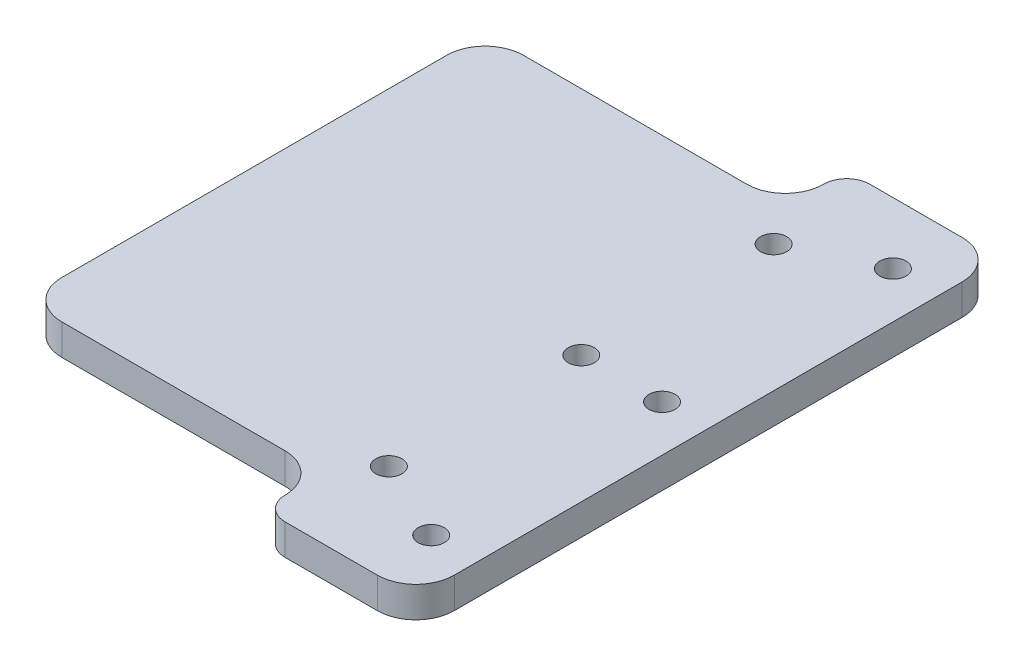
ISO-10303-21;
HEADER;
FILE_DESCRIPTION(('STEP AP214'),'2;1');
FILE_NAME('part.step','',(''),(''),'','','');
FILE_SCHEMA(('AUTOMOTIVE_DESIGN { 1 0 10303 214 1 1 1 1 }'));
ENDSEC;
DATA;
#1=APPLICATION_CONTEXT('core data for automotive mechanical design processes');
#2=APPLICATION_PROTOCOL_DEFINITION('international standard','automotive_design',2000,#1);
#3=PRODUCT_CONTEXT('',#1,'mechanical');
#4=PRODUCT('Part','Part','',(#3));
#5=PRODUCT_RELATED_PRODUCT_CATEGORY('part','',(#4));
#6=PRODUCT_DEFINITION_FORMATION('','',#4);
#7=PRODUCT_DEFINITION_CONTEXT('part definition',#1,'design');
#8=PRODUCT_DEFINITION('design','',#6,#7);
#9=PRODUCT_DEFINITION_SHAPE('','',#8);
#10=(LENGTH_UNIT() NAMED_UNIT(*) SI_UNIT(.MILLI.,.METRE.));
#11=(NAMED_UNIT(*) PLANE_ANGLE_UNIT() SI_UNIT($,.RADIAN.));
#12=(NAMED_UNIT(*) SI_UNIT($,.STERADIAN.) SOLID_ANGLE_UNIT());
#13=UNCERTAINTY_MEASURE_WITH_UNIT(LENGTH_MEASURE(1.E-05),#10,'distance_accuracy_value','');
#14=(GEOMETRIC_REPRESENTATION_CONTEXT(3) GLOBAL_UNCERTAINTY_ASSIGNED_CONTEXT((#13)) GLOBAL_UNIT_ASSIGNED_CONTEXT((#10,
#11,#12)) REPRESENTATION_CONTEXT('',''));
#15=CARTESIAN_POINT('',(0.,0.,0.));
#16=DIRECTION('',(0.,0.,1.));
#17=DIRECTION('',(1.,0.,0.));
#18=AXIS2_PLACEMENT_3D('',#15,#16,#17);
#19=CARTESIAN_POINT('',(0.,4.,0.));
#20=DIRECTION('',(0.,-1.,0.));
#21=DIRECTION('',(0.,0.,-1.));
#22=AXIS2_PLACEMENT_3D('',#19,#20,#21);
#23=PLANE('',#22);
#24=CARTESIAN_POINT('',(34.,4.,35.));
#25=DIRECTION('',(0.,-1.,0.));
#26=DIRECTION('',(0.,0.,-1.));
#27=AXIS2_PLACEMENT_3D('',#24,#25,#26);
#28=CIRCLE('',#27,5.);
#29=CARTESIAN_POINT('',(34.,4.,30.));
#30=VERTEX_POINT('',#29);
#31=CARTESIAN_POINT('',(39.,4.,35.));
#32=VERTEX_POINT('',#31);
#33=EDGE_CURVE('E222',#30,#32,#28,.T.);
#34=ORIENTED_EDGE('',*,*,#33,.T.);
#35=CARTESIAN_POINT('',(42.,4.,35.));
#36=DIRECTION('',(0.,-1.,0.));
#37=DIRECTION('',(0.,0.,-1.));
#38=AXIS2_PLACEMENT_3D('',#35,#36,#37);
#39=CIRCLE('',#38,3.);
#40=CARTESIAN_POINT('',(42.,4.,38.));
#41=VERTEX_POINT('',#40);
#42=EDGE_CURVE('E47',#32,#41,#39,.F.);
#43=ORIENTED_EDGE('',*,*,#42,.T.);
#44=DIRECTION('',(1.,0.,0.));
#45=VECTOR('',#44,1.);
#46=CARTESIAN_POINT('',(59.,4.,38.));
#47=LINE('',#46,#45);
#48=CARTESIAN_POINT('',(54.,4.,38.));
#49=VERTEX_POINT('',#48);
#50=EDGE_CURVE('E177',#41,#49,#47,.T.);
#51=ORIENTED_EDGE('',*,*,#50,.T.);
#52=CARTESIAN_POINT('',(54.,4.,33.));
#53=DIRECTION('',(0.,-1.,0.));
#54=DIRECTION('',(0.,0.,-1.));
#55=AXIS2_PLACEMENT_3D('',#52,#53,#54);
#56=CIRCLE('',#55,5.);
#57=CARTESIAN_POINT('',(59.,4.,33.));
#58=VERTEX_POINT('',#57);
#59=EDGE_CURVE('E189',#49,#58,#56,.F.);
#60=ORIENTED_EDGE('',*,*,#59,.T.);
#61=DIRECTION('',(0.,0.,-1.));
#62=VECTOR('',#61,1.);
#63=CARTESIAN_POINT('',(59.,4.,-38.));
#64=LINE('',#63,#62);
#65=CARTESIAN_POINT('',(59.,4.,-33.));
#66=VERTEX_POINT('',#65);
#67=EDGE_CURVE('E171',#58,#66,#64,.T.);
#68=ORIENTED_EDGE('',*,*,#67,.T.);
#69=CARTESIAN_POINT('',(54.,4.,-33.));
#70=DIRECTION('',(0.,-1.,0.));
#71=DIRECTION('',(0.,0.,-1.));
#72=AXIS2_PLACEMENT_3D('',#69,#70,#71);
#73=CIRCLE('',#72,5.);
#74=CARTESIAN_POINT('',(54.,4.,-38.));
#75=VERTEX_POINT('',#74);
#76=EDGE_CURVE('E187',#66,#75,#73,.F.);
#77=ORIENTED_EDGE('',*,*,#76,.T.);
#78=DIRECTION('',(-1.,0.,0.));
#79=VECTOR('',#78,1.);
#80=CARTESIAN_POINT('',(39.,4.,-38.));
#81=LINE('',#80,#79);
#82=CARTESIAN_POINT('',(42.,4.,-38.));
#83=VERTEX_POINT('',#82);
#84=EDGE_CURVE('E323',#75,#83,#81,.T.);
#85=ORIENTED_EDGE('',*,*,#84,.T.);
#86=CARTESIAN_POINT('',(42.,4.,-35.));
#87=DIRECTION('',(0.,-1.,0.));
#88=DIRECTION('',(0.,0.,-1.));
#89=AXIS2_PLACEMENT_3D('',#86,#87,#88);
#90=CIRCLE('',#89,3.);
#91=CARTESIAN_POINT('',(39.,4.,-35.));
#92=VERTEX_POINT('',#91);
#93=EDGE_CURVE('E230',#83,#92,#90,.F.);
#94=ORIENTED_EDGE('',*,*,#93,.T.);
#95=CARTESIAN_POINT('',(34.,4.,-35.));
#96=DIRECTION('',(0.,-1.,0.));
#97=DIRECTION('',(0.,0.,-1.));
#98=AXIS2_PLACEMENT_3D('',#95,#96,#97);
#99=CIRCLE('',#98,5.);
#100=CARTESIAN_POINT('',(34.,4.,-30.));
#101=VERTEX_POINT('',#100);
#102=EDGE_CURVE('E219',#92,#101,#99,.T.);
#103=ORIENTED_EDGE('',*,*,#102,.T.);
#104=DIRECTION('',(-1.,0.,0.));
#105=VECTOR('',#104,1.);
#106=CARTESIAN_POINT('',(0.,4.,-30.));
#107=LINE('',#106,#105);
#108=CARTESIAN_POINT('',(5.,4.,-30.));
#109=VERTEX_POINT('',#108);
#110=EDGE_CURVE('E250',#101,#109,#107,.T.);
#111=ORIENTED_EDGE('',*,*,#110,.T.);
#112=CARTESIAN_POINT('',(5.,4.,-25.));
#113=DIRECTION('',(0.,-1.,0.));
#114=DIRECTION('',(0.,0.,-1.));
#115=AXIS2_PLACEMENT_3D('',#112,#113,#114);
#116=CIRCLE('',#115,5.);
#117=CARTESIAN_POINT('',(0.,4.,-25.));
#118=VERTEX_POINT('',#117);
#119=EDGE_CURVE('E191',#109,#118,#116,.F.);
#120=ORIENTED_EDGE('',*,*,#119,.T.);
#121=DIRECTION('',(0.,0.,1.));
#122=VECTOR('',#121,1.);
#123=CARTESIAN_POINT('',(0.,4.,0.));
#124=LINE('',#123,#122);
#125=CARTESIAN_POINT('',(0.,4.,25.));
#126=VERTEX_POINT('',#125);
#127=EDGE_CURVE('E248',#118,#126,#124,.T.);
#128=ORIENTED_EDGE('',*,*,#127,.T.);
#129=CARTESIAN_POINT('',(5.,4.,25.));
#130=DIRECTION('',(0.,-1.,0.));
#131=DIRECTION('',(0.,0.,-1.));
#132=AXIS2_PLACEMENT_3D('',#129,#130,#131);
#133=CIRCLE('',#132,5.);
#134=CARTESIAN_POINT('',(5.,4.,30.));
#135=VERTEX_POINT('',#134);
#136=EDGE_CURVE('E193',#126,#135,#133,.F.);
#137=ORIENTED_EDGE('',*,*,#136,.T.);
#138=DIRECTION('',(1.,0.,0.));
#139=VECTOR('',#138,1.);
#140=CARTESIAN_POINT('',(39.,4.,30.));
#141=LINE('',#140,#139);
#142=EDGE_CURVE('E159',#135,#30,#141,.T.);
#143=ORIENTED_EDGE('',*,*,#142,.T.);
#144=EDGE_LOOP('',(#34,#43,#51,#60,#68,#77,#85,#94,#103,#111,#120,#128,#137,#143));
#145=FACE_BOUND('',#144,.T.);
#146=CARTESIAN_POINT('',(42.5,4.,25.));
#147=DIRECTION('',(0.,1.,0.));
#148=DIRECTION('',(0.,0.,1.));
#149=AXIS2_PLACEMENT_3D('',#146,#147,#148);
#150=CIRCLE('',#149,1.69999999999999);
#151=CARTESIAN_POINT('',(42.5,4.,26.7));
#152=VERTEX_POINT('',#151);
#153=EDGE_CURVE('E258',#152,#152,#150,.T.);
#154=ORIENTED_EDGE('',*,*,#153,.F.);
#155=EDGE_LOOP('',(#154));
#156=FACE_BOUND('',#155,.T.);
#157=CARTESIAN_POINT('',(42.5,4.,-25.));
#158=DIRECTION('',(0.,1.,0.));
#159=DIRECTION('',(0.,0.,1.));
#160=AXIS2_PLACEMENT_3D('',#157,#158,#159);
#161=CIRCLE('',#160,1.69999999999999);
#162=CARTESIAN_POINT('',(42.5,4.,-23.3));
#163=VERTEX_POINT('',#162);
#164=EDGE_CURVE('E313',#163,#163,#161,.T.);
#165=ORIENTED_EDGE('',*,*,#164,.F.);
#166=EDGE_LOOP('',(#165));
#167=FACE_BOUND('',#166,.T.);
#168=CARTESIAN_POINT('',(42.5,4.,0.));
#169=DIRECTION('',(0.,1.,0.));
#170=DIRECTION('',(0.,0.,1.));
#171=AXIS2_PLACEMENT_3D('',#168,#169,#170);
#172=CIRCLE('',#171,1.7);
#173=CARTESIAN_POINT('',(42.5,4.,1.7));
#174=VERTEX_POINT('',#173);
#175=EDGE_CURVE('E506',#174,#174,#172,.T.);
#176=ORIENTED_EDGE('',*,*,#175,.F.);
#177=EDGE_LOOP('',(#176));
#178=FACE_BOUND('',#177,.T.);
#179=CARTESIAN_POINT('',(53.,4.,-30.));
#180=DIRECTION('',(0.,1.,0.));
#181=DIRECTION('',(0.,0.,1.));
#182=AXIS2_PLACEMENT_3D('',#179,#180,#181);
#183=CIRCLE('',#182,1.7);
#184=CARTESIAN_POINT('',(53.,4.,-28.3));
#185=VERTEX_POINT('',#184);
#186=EDGE_CURVE('E511',#185,#185,#183,.T.);
#187=ORIENTED_EDGE('',*,*,#186,.F.);
#188=EDGE_LOOP('',(#187));
#189=FACE_BOUND('',#188,.T.);
#190=CARTESIAN_POINT('',(53.,4.,0.));
#191=DIRECTION('',(0.,1.,0.));
#192=DIRECTION('',(0.,0.,1.));
#193=AXIS2_PLACEMENT_3D('',#190,#191,#192);
#194=CIRCLE('',#193,1.7);
#195=CARTESIAN_POINT('',(53.,4.,1.7));
#196=VERTEX_POINT('',#195);
#197=EDGE_CURVE('E535',#196,#196,#194,.T.);
#198=ORIENTED_EDGE('',*,*,#197,.F.);
#199=EDGE_LOOP('',(#198));
#200=FACE_BOUND('',#199,.T.);
#201=CARTESIAN_POINT('',(53.,4.,30.));
#202=DIRECTION('',(0.,1.,0.));
#203=DIRECTION('',(0.,0.,1.));
#204=AXIS2_PLACEMENT_3D('',#201,#202,#203);
#205=CIRCLE('',#204,1.7);
#206=CARTESIAN_POINT('',(53.,4.,31.7));
#207=VERTEX_POINT('',#206);
#208=EDGE_CURVE('E529',#207,#207,#205,.T.);
#209=ORIENTED_EDGE('',*,*,#208,.F.);
#210=EDGE_LOOP('',(#209));
#211=FACE_BOUND('',#210,.T.);
#212=ADVANCED_FACE('F39',(#145,#156,#167,#178,#189,#200,#211),#23,.F.);
#213=CARTESIAN_POINT('',(0.,0.,0.));
#214=DIRECTION('',(0.,-1.,0.));
#215=DIRECTION('',(0.,0.,-1.));
#216=AXIS2_PLACEMENT_3D('',#213,#214,#215);
#217=PLANE('',#216);
#218=CARTESIAN_POINT('',(53.,0.,0.));
#219=DIRECTION('',(0.,1.,0.));
#220=DIRECTION('',(0.,0.,1.));
#221=AXIS2_PLACEMENT_3D('',#218,#219,#220);
#222=CIRCLE('',#221,1.7);
#223=CARTESIAN_POINT('',(53.,0.,1.7));
#224=VERTEX_POINT('',#223);
#225=EDGE_CURVE('E532',#224,#224,#222,.T.);
#226=ORIENTED_EDGE('',*,*,#225,.T.);
#227=EDGE_LOOP('',(#226));
#228=FACE_BOUND('',#227,.T.);
#229=CARTESIAN_POINT('',(42.5,0.,0.));
#230=DIRECTION('',(0.,1.,0.));
#231=DIRECTION('',(0.,0.,1.));
#232=AXIS2_PLACEMENT_3D('',#229,#230,#231);
#233=CIRCLE('',#232,1.7);
#234=CARTESIAN_POINT('',(42.5,0.,1.7));
#235=VERTEX_POINT('',#234);
#236=EDGE_CURVE('E509',#235,#235,#233,.T.);
#237=ORIENTED_EDGE('',*,*,#236,.T.);
#238=EDGE_LOOP('',(#237));
#239=FACE_BOUND('',#238,.T.);
#240=CARTESIAN_POINT('',(42.5,0.,25.));
#241=DIRECTION('',(0.,1.,0.));
#242=DIRECTION('',(0.,0.,1.));
#243=AXIS2_PLACEMENT_3D('',#240,#241,#242);
#244=CIRCLE('',#243,1.69999999999999);
#245=CARTESIAN_POINT('',(42.5,0.,26.7));
#246=VERTEX_POINT('',#245);
#247=EDGE_CURVE('E311',#246,#246,#244,.T.);
#248=ORIENTED_EDGE('',*,*,#247,.T.);
#249=EDGE_LOOP('',(#248));
#250=FACE_BOUND('',#249,.T.);
#251=DIRECTION('',(1.,0.,0.));
#252=VECTOR('',#251,1.);
#253=CARTESIAN_POINT('',(59.,0.,38.));
#254=LINE('',#253,#252);
#255=CARTESIAN_POINT('',(42.,0.,38.));
#256=VERTEX_POINT('',#255);
#257=CARTESIAN_POINT('',(54.,0.,38.));
#258=VERTEX_POINT('',#257);
#259=EDGE_CURVE('E168',#256,#258,#254,.T.);
#260=ORIENTED_EDGE('',*,*,#259,.F.);
#261=CARTESIAN_POINT('',(42.,0.,35.));
#262=DIRECTION('',(0.,-1.,0.));
#263=DIRECTION('',(0.,0.,-1.));
#264=AXIS2_PLACEMENT_3D('',#261,#262,#263);
#265=CIRCLE('',#264,3.);
#266=CARTESIAN_POINT('',(39.,0.,35.));
#267=VERTEX_POINT('',#266);
#268=EDGE_CURVE('E228',#256,#267,#265,.T.);
#269=ORIENTED_EDGE('',*,*,#268,.T.);
#270=CARTESIAN_POINT('',(34.,0.,35.));
#271=DIRECTION('',(0.,-1.,0.));
#272=DIRECTION('',(0.,0.,-1.));
#273=AXIS2_PLACEMENT_3D('',#270,#271,#272);
#274=CIRCLE('',#273,5.);
#275=CARTESIAN_POINT('',(34.,0.,30.));
#276=VERTEX_POINT('',#275);
#277=EDGE_CURVE('E167',#267,#276,#274,.F.);
#278=ORIENTED_EDGE('',*,*,#277,.T.);
#279=DIRECTION('',(1.,0.,0.));
#280=VECTOR('',#279,1.);
#281=CARTESIAN_POINT('',(39.,0.,30.));
#282=LINE('',#281,#280);
#283=CARTESIAN_POINT('',(5.,0.,30.));
#284=VERTEX_POINT('',#283);
#285=EDGE_CURVE('E156',#284,#276,#282,.T.);
#286=ORIENTED_EDGE('',*,*,#285,.F.);
#287=CARTESIAN_POINT('',(5.,0.,25.));
#288=DIRECTION('',(0.,-1.,0.));
#289=DIRECTION('',(0.,0.,-1.));
#290=AXIS2_PLACEMENT_3D('',#287,#288,#289);
#291=CIRCLE('',#290,5.);
#292=CARTESIAN_POINT('',(0.,0.,25.));
#293=VERTEX_POINT('',#292);
#294=EDGE_CURVE('E140',#284,#293,#291,.T.);
#295=ORIENTED_EDGE('',*,*,#294,.T.);
#296=DIRECTION('',(0.,0.,1.));
#297=VECTOR('',#296,1.);
#298=CARTESIAN_POINT('',(0.,0.,30.));
#299=LINE('',#298,#297);
#300=CARTESIAN_POINT('',(0.,0.,-25.));
#301=VERTEX_POINT('',#300);
#302=EDGE_CURVE('E169',#301,#293,#299,.T.);
#303=ORIENTED_EDGE('',*,*,#302,.F.);
#304=CARTESIAN_POINT('',(5.,0.,-25.));
#305=DIRECTION('',(0.,-1.,0.));
#306=DIRECTION('',(0.,0.,-1.));
#307=AXIS2_PLACEMENT_3D('',#304,#305,#306);
#308=CIRCLE('',#307,5.);
#309=CARTESIAN_POINT('',(5.,0.,-30.));
#310=VERTEX_POINT('',#309);
#311=EDGE_CURVE('E150',#301,#310,#308,.T.);
#312=ORIENTED_EDGE('',*,*,#311,.T.);
#313=DIRECTION('',(-1.,0.,0.));
#314=VECTOR('',#313,1.);
#315=CARTESIAN_POINT('',(0.,0.,-30.));
#316=LINE('',#315,#314);
#317=CARTESIAN_POINT('',(34.,0.,-30.));
#318=VERTEX_POINT('',#317);
#319=EDGE_CURVE('E173',#318,#310,#316,.T.);
#320=ORIENTED_EDGE('',*,*,#319,.F.);
#321=CARTESIAN_POINT('',(34.,0.,-35.));
#322=DIRECTION('',(0.,-1.,0.));
#323=DIRECTION('',(0.,0.,-1.));
#324=AXIS2_PLACEMENT_3D('',#321,#322,#323);
#325=CIRCLE('',#324,5.);
#326=CARTESIAN_POINT('',(39.,0.,-35.));
#327=VERTEX_POINT('',#326);
#328=EDGE_CURVE('E217',#318,#327,#325,.F.);
#329=ORIENTED_EDGE('',*,*,#328,.T.);
#330=CARTESIAN_POINT('',(42.,0.,-35.));
#331=DIRECTION('',(0.,-1.,0.));
#332=DIRECTION('',(0.,0.,-1.));
#333=AXIS2_PLACEMENT_3D('',#330,#331,#332);
#334=CIRCLE('',#333,3.);
#335=CARTESIAN_POINT('',(42.,0.,-38.));
#336=VERTEX_POINT('',#335);
#337=EDGE_CURVE('E60',#327,#336,#334,.T.);
#338=ORIENTED_EDGE('',*,*,#337,.T.);
#339=DIRECTION('',(-1.,0.,0.));
#340=VECTOR('',#339,1.);
#341=CARTESIAN_POINT('',(39.,0.,-38.));
#342=LINE('',#341,#340);
#343=CARTESIAN_POINT('',(54.,0.,-38.));
#344=VERTEX_POINT('',#343);
#345=EDGE_CURVE('E257',#344,#336,#342,.T.);
#346=ORIENTED_EDGE('',*,*,#345,.F.);
#347=CARTESIAN_POINT('',(54.,0.,-33.));
#348=DIRECTION('',(0.,-1.,0.));
#349=DIRECTION('',(0.,0.,-1.));
#350=AXIS2_PLACEMENT_3D('',#347,#348,#349);
#351=CIRCLE('',#350,5.);
#352=CARTESIAN_POINT('',(59.,0.,-33.));
#353=VERTEX_POINT('',#352);
#354=EDGE_CURVE('E160',#344,#353,#351,.T.);
#355=ORIENTED_EDGE('',*,*,#354,.T.);
#356=DIRECTION('',(0.,0.,-1.));
#357=VECTOR('',#356,1.);
#358=CARTESIAN_POINT('',(59.,0.,-38.));
#359=LINE('',#358,#357);
#360=CARTESIAN_POINT('',(59.,0.,33.));
#361=VERTEX_POINT('',#360);
#362=EDGE_CURVE('E254',#361,#353,#359,.T.);
#363=ORIENTED_EDGE('',*,*,#362,.F.);
#364=CARTESIAN_POINT('',(54.,0.,33.));
#365=DIRECTION('',(0.,-1.,0.));
#366=DIRECTION('',(0.,0.,-1.));
#367=AXIS2_PLACEMENT_3D('',#364,#365,#366);
#368=CIRCLE('',#367,5.);
#369=EDGE_CURVE('E180',#361,#258,#368,.T.);
#370=ORIENTED_EDGE('',*,*,#369,.T.);
#371=EDGE_LOOP('',(#260,#269,#278,#286,#295,#303,#312,#320,#329,#338,#346,#355,#363,#370));
#372=FACE_BOUND('',#371,.T.);
#373=CARTESIAN_POINT('',(42.5,0.,-25.));
#374=DIRECTION('',(0.,1.,0.));
#375=DIRECTION('',(0.,0.,1.));
#376=AXIS2_PLACEMENT_3D('',#373,#374,#375);
#377=CIRCLE('',#376,1.69999999999999);
#378=CARTESIAN_POINT('',(42.5,0.,-23.3));
#379=VERTEX_POINT('',#378);
#380=EDGE_CURVE('E317',#379,#379,#377,.T.);
#381=ORIENTED_EDGE('',*,*,#380,.T.);
#382=EDGE_LOOP('',(#381));
#383=FACE_BOUND('',#382,.T.);
#384=CARTESIAN_POINT('',(53.,0.,-30.));
#385=DIRECTION('',(0.,1.,0.));
#386=DIRECTION('',(0.,0.,1.));
#387=AXIS2_PLACEMENT_3D('',#384,#385,#386);
#388=CIRCLE('',#387,1.7);
#389=CARTESIAN_POINT('',(53.,0.,-28.3));
#390=VERTEX_POINT('',#389);
#391=EDGE_CURVE('E515',#390,#390,#388,.T.);
#392=ORIENTED_EDGE('',*,*,#391,.T.);
#393=EDGE_LOOP('',(#392));
#394=FACE_BOUND('',#393,.T.);
#395=CARTESIAN_POINT('',(53.,0.,30.));
#396=DIRECTION('',(0.,1.,0.));
#397=DIRECTION('',(0.,0.,1.));
#398=AXIS2_PLACEMENT_3D('',#395,#396,#397);
#399=CIRCLE('',#398,1.7);
#400=CARTESIAN_POINT('',(53.,0.,31.7));
#401=VERTEX_POINT('',#400);
#402=EDGE_CURVE('E527',#401,#401,#399,.T.);
#403=ORIENTED_EDGE('',*,*,#402,.T.);
#404=EDGE_LOOP('',(#403));
#405=FACE_BOUND('',#404,.T.);
#406=ADVANCED_FACE('F164',(#228,#239,#250,#372,#383,#394,#405),#217,.T.);
#407=CARTESIAN_POINT('',(59.,4.,-38.));
#408=DIRECTION('',(-1.,0.,0.));
#409=DIRECTION('',(0.,0.,1.));
#410=AXIS2_PLACEMENT_3D('',#407,#408,#409);
#411=PLANE('',#410);
#412=ORIENTED_EDGE('',*,*,#67,.F.);
#413=DIRECTION('',(0.,-1.,0.));
#414=VECTOR('',#413,1.);
#415=CARTESIAN_POINT('',(59.,4.,33.));
#416=LINE('',#415,#414);
#417=EDGE_CURVE('E208',#58,#361,#416,.T.);
#418=ORIENTED_EDGE('',*,*,#417,.T.);
#419=ORIENTED_EDGE('',*,*,#362,.T.);
#420=DIRECTION('',(0.,-1.,0.));
#421=VECTOR('',#420,1.);
#422=CARTESIAN_POINT('',(59.,4.,-33.));
#423=LINE('',#422,#421);
#424=EDGE_CURVE('E206',#353,#66,#423,.F.);
#425=ORIENTED_EDGE('',*,*,#424,.T.);
#426=EDGE_LOOP('',(#412,#418,#419,#425));
#427=FACE_BOUND('',#426,.T.);
#428=ADVANCED_FACE('F288',(#427),#411,.F.);
#429=CARTESIAN_POINT('',(39.,4.,-38.));
#430=DIRECTION('',(0.,0.,1.));
#431=DIRECTION('',(1.,0.,0.));
#432=AXIS2_PLACEMENT_3D('',#429,#430,#431);
#433=PLANE('',#432);
#434=ORIENTED_EDGE('',*,*,#345,.T.);
#435=DIRECTION('',(0.,-1.,0.));
#436=VECTOR('',#435,1.);
#437=CARTESIAN_POINT('',(42.,4.,-38.));
#438=LINE('',#437,#436);
#439=EDGE_CURVE('E11',#336,#83,#438,.F.);
#440=ORIENTED_EDGE('',*,*,#439,.T.);
#441=ORIENTED_EDGE('',*,*,#84,.F.);
#442=DIRECTION('',(0.,-1.,0.));
#443=VECTOR('',#442,1.);
#444=CARTESIAN_POINT('',(54.,4.,-38.));
#445=LINE('',#444,#443);
#446=EDGE_CURVE('E214',#75,#344,#445,.T.);
#447=ORIENTED_EDGE('',*,*,#446,.T.);
#448=EDGE_LOOP('',(#434,#440,#441,#447));
#449=FACE_BOUND('',#448,.T.);
#450=ADVANCED_FACE('F281',(#449),#433,.F.);
#451=CARTESIAN_POINT('',(0.,4.,-30.));
#452=DIRECTION('',(0.,0.,1.));
#453=DIRECTION('',(1.,0.,0.));
#454=AXIS2_PLACEMENT_3D('',#451,#452,#453);
#455=PLANE('',#454);
#456=ORIENTED_EDGE('',*,*,#319,.T.);
#457=DIRECTION('',(0.,-1.,0.));
#458=VECTOR('',#457,1.);
#459=CARTESIAN_POINT('',(5.,4.,-30.));
#460=LINE('',#459,#458);
#461=EDGE_CURVE('E198',#310,#109,#460,.F.);
#462=ORIENTED_EDGE('',*,*,#461,.T.);
#463=ORIENTED_EDGE('',*,*,#110,.F.);
#464=DIRECTION('',(0.,-1.,0.));
#465=VECTOR('',#464,1.);
#466=CARTESIAN_POINT('',(34.,0.,-30.));
#467=LINE('',#466,#465);
#468=EDGE_CURVE('E195',#101,#318,#467,.T.);
#469=ORIENTED_EDGE('',*,*,#468,.T.);
#470=EDGE_LOOP('',(#456,#462,#463,#469));
#471=FACE_BOUND('',#470,.T.);
#472=ADVANCED_FACE('F263',(#471),#455,.F.);
#473=CARTESIAN_POINT('',(0.,4.,30.));
#474=DIRECTION('',(1.,0.,0.));
#475=DIRECTION('',(0.,0.,-1.));
#476=AXIS2_PLACEMENT_3D('',#473,#474,#475);
#477=PLANE('',#476);
#478=ORIENTED_EDGE('',*,*,#302,.T.);
#479=DIRECTION('',(0.,-1.,0.));
#480=VECTOR('',#479,1.);
#481=CARTESIAN_POINT('',(0.,4.,25.));
#482=LINE('',#481,#480);
#483=EDGE_CURVE('E145',#293,#126,#482,.F.);
#484=ORIENTED_EDGE('',*,*,#483,.T.);
#485=ORIENTED_EDGE('',*,*,#127,.F.);
#486=DIRECTION('',(0.,-1.,0.));
#487=VECTOR('',#486,1.);
#488=CARTESIAN_POINT('',(0.,4.,-25.));
#489=LINE('',#488,#487);
#490=EDGE_CURVE('E149',#118,#301,#489,.T.);
#491=ORIENTED_EDGE('',*,*,#490,.T.);
#492=EDGE_LOOP('',(#478,#484,#485,#491));
#493=FACE_BOUND('',#492,.T.);
#494=ADVANCED_FACE('F273',(#493),#477,.F.);
#495=CARTESIAN_POINT('',(39.,4.,30.));
#496=DIRECTION('',(0.,0.,-1.));
#497=DIRECTION('',(-1.,0.,0.));
#498=AXIS2_PLACEMENT_3D('',#495,#496,#497);
#499=PLANE('',#498);
#500=ORIENTED_EDGE('',*,*,#142,.F.);
#501=DIRECTION('',(0.,-1.,0.));
#502=VECTOR('',#501,1.);
#503=CARTESIAN_POINT('',(5.,4.,30.));
#504=LINE('',#503,#502);
#505=EDGE_CURVE('E144',#135,#284,#504,.T.);
#506=ORIENTED_EDGE('',*,*,#505,.T.);
#507=ORIENTED_EDGE('',*,*,#285,.T.);
#508=DIRECTION('',(0.,-1.,0.));
#509=VECTOR('',#508,1.);
#510=CARTESIAN_POINT('',(34.,4.,30.));
#511=LINE('',#510,#509);
#512=EDGE_CURVE('E161',#276,#30,#511,.F.);
#513=ORIENTED_EDGE('',*,*,#512,.T.);
#514=EDGE_LOOP('',(#500,#506,#507,#513));
#515=FACE_BOUND('',#514,.T.);
#516=ADVANCED_FACE('F155',(#515),#499,.F.);
#517=CARTESIAN_POINT('',(59.,4.,38.));
#518=DIRECTION('',(0.,0.,-1.));
#519=DIRECTION('',(-1.,0.,0.));
#520=AXIS2_PLACEMENT_3D('',#517,#518,#519);
#521=PLANE('',#520);
#522=ORIENTED_EDGE('',*,*,#50,.F.);
#523=DIRECTION('',(0.,-1.,0.));
#524=VECTOR('',#523,1.);
#525=CARTESIAN_POINT('',(42.,4.,38.));
#526=LINE('',#525,#524);
#527=EDGE_CURVE('E224',#41,#256,#526,.T.);
#528=ORIENTED_EDGE('',*,*,#527,.T.);
#529=ORIENTED_EDGE('',*,*,#259,.T.);
#530=DIRECTION('',(0.,-1.,0.));
#531=VECTOR('',#530,1.);
#532=CARTESIAN_POINT('',(54.,4.,38.));
#533=LINE('',#532,#531);
#534=EDGE_CURVE('E211',#258,#49,#533,.F.);
#535=ORIENTED_EDGE('',*,*,#534,.T.);
#536=EDGE_LOOP('',(#522,#528,#529,#535));
#537=FACE_BOUND('',#536,.T.);
#538=ADVANCED_FACE('F240',(#537),#521,.F.);
#539=CARTESIAN_POINT('',(42.5,4.,25.));
#540=DIRECTION('',(0.,-1.,0.));
#541=DIRECTION('',(0.,0.,-1.));
#542=AXIS2_PLACEMENT_3D('',#539,#540,#541);
#543=CYLINDRICAL_SURFACE('',#542,1.69999999999999);
#544=ORIENTED_EDGE('',*,*,#153,.T.);
#545=EDGE_LOOP('',(#544));
#546=FACE_BOUND('',#545,.T.);
#547=ORIENTED_EDGE('',*,*,#247,.F.);
#548=EDGE_LOOP('',(#547));
#549=FACE_BOUND('',#548,.T.);
#550=ADVANCED_FACE('F292',(#546,#549),#543,.F.);
#551=CARTESIAN_POINT('',(42.5,4.,-25.));
#552=DIRECTION('',(0.,-1.,0.));
#553=DIRECTION('',(0.,0.,-1.));
#554=AXIS2_PLACEMENT_3D('',#551,#552,#553);
#555=CYLINDRICAL_SURFACE('',#554,1.69999999999999);
#556=ORIENTED_EDGE('',*,*,#164,.T.);
#557=EDGE_LOOP('',(#556));
#558=FACE_BOUND('',#557,.T.);
#559=ORIENTED_EDGE('',*,*,#380,.F.);
#560=EDGE_LOOP('',(#559));
#561=FACE_BOUND('',#560,.T.);
#562=ADVANCED_FACE('F299',(#558,#561),#555,.F.);
#563=CARTESIAN_POINT('',(42.5,4.,0.));
#564=DIRECTION('',(0.,-1.,0.));
#565=DIRECTION('',(0.,0.,-1.));
#566=AXIS2_PLACEMENT_3D('',#563,#564,#565);
#567=CYLINDRICAL_SURFACE('',#566,1.7);
#568=ORIENTED_EDGE('',*,*,#175,.T.);
#569=EDGE_LOOP('',(#568));
#570=FACE_BOUND('',#569,.T.);
#571=ORIENTED_EDGE('',*,*,#236,.F.);
#572=EDGE_LOOP('',(#571));
#573=FACE_BOUND('',#572,.T.);
#574=ADVANCED_FACE('F304',(#570,#573),#567,.F.);
#575=CARTESIAN_POINT('',(53.,4.,-30.));
#576=DIRECTION('',(0.,-1.,0.));
#577=DIRECTION('',(0.,0.,-1.));
#578=AXIS2_PLACEMENT_3D('',#575,#576,#577);
#579=CYLINDRICAL_SURFACE('',#578,1.7);
#580=ORIENTED_EDGE('',*,*,#186,.T.);
#581=EDGE_LOOP('',(#580));
#582=FACE_BOUND('',#581,.T.);
#583=ORIENTED_EDGE('',*,*,#391,.F.);
#584=EDGE_LOOP('',(#583));
#585=FACE_BOUND('',#584,.T.);
#586=ADVANCED_FACE('F471',(#582,#585),#579,.F.);
#587=CARTESIAN_POINT('',(53.,4.,0.));
#588=DIRECTION('',(0.,-1.,0.));
#589=DIRECTION('',(0.,0.,-1.));
#590=AXIS2_PLACEMENT_3D('',#587,#588,#589);
#591=CYLINDRICAL_SURFACE('',#590,1.7);
#592=ORIENTED_EDGE('',*,*,#197,.T.);
#593=EDGE_LOOP('',(#592));
#594=FACE_BOUND('',#593,.T.);
#595=ORIENTED_EDGE('',*,*,#225,.F.);
#596=EDGE_LOOP('',(#595));
#597=FACE_BOUND('',#596,.T.);
#598=ADVANCED_FACE('F461',(#594,#597),#591,.F.);
#599=CARTESIAN_POINT('',(53.,4.,30.));
#600=DIRECTION('',(0.,-1.,0.));
#601=DIRECTION('',(0.,0.,-1.));
#602=AXIS2_PLACEMENT_3D('',#599,#600,#601);
#603=CYLINDRICAL_SURFACE('',#602,1.7);
#604=ORIENTED_EDGE('',*,*,#208,.T.);
#605=EDGE_LOOP('',(#604));
#606=FACE_BOUND('',#605,.T.);
#607=ORIENTED_EDGE('',*,*,#402,.F.);
#608=EDGE_LOOP('',(#607));
#609=FACE_BOUND('',#608,.T.);
#610=ADVANCED_FACE('F430',(#606,#609),#603,.F.);
#611=CARTESIAN_POINT('',(5.,4.,25.));
#612=DIRECTION('',(0.,-1.,0.));
#613=DIRECTION('',(0.,0.,-1.));
#614=AXIS2_PLACEMENT_3D('',#611,#612,#613);
#615=CYLINDRICAL_SURFACE('',#614,5.);
#616=ORIENTED_EDGE('',*,*,#136,.F.);
#617=ORIENTED_EDGE('',*,*,#483,.F.);
#618=ORIENTED_EDGE('',*,*,#294,.F.);
#619=ORIENTED_EDGE('',*,*,#505,.F.);
#620=EDGE_LOOP('',(#616,#617,#618,#619));
#621=FACE_BOUND('',#620,.T.);
#622=ADVANCED_FACE('F143',(#621),#615,.T.);
#623=CARTESIAN_POINT('',(5.,4.,-25.));
#624=DIRECTION('',(0.,-1.,0.));
#625=DIRECTION('',(0.,0.,-1.));
#626=AXIS2_PLACEMENT_3D('',#623,#624,#625);
#627=CYLINDRICAL_SURFACE('',#626,5.);
#628=ORIENTED_EDGE('',*,*,#119,.F.);
#629=ORIENTED_EDGE('',*,*,#461,.F.);
#630=ORIENTED_EDGE('',*,*,#311,.F.);
#631=ORIENTED_EDGE('',*,*,#490,.F.);
#632=EDGE_LOOP('',(#628,#629,#630,#631));
#633=FACE_BOUND('',#632,.T.);
#634=ADVANCED_FACE('F269',(#633),#627,.T.);
#635=CARTESIAN_POINT('',(34.,4.,-35.));
#636=DIRECTION('',(0.,1.,0.));
#637=DIRECTION('',(0.,0.,1.));
#638=AXIS2_PLACEMENT_3D('',#635,#636,#637);
#639=CYLINDRICAL_SURFACE('',#638,5.);
#640=ORIENTED_EDGE('',*,*,#102,.F.);
#641=DIRECTION('',(0.,-1.,0.));
#642=VECTOR('',#641,1.);
#643=CARTESIAN_POINT('',(39.,4.,-35.));
#644=LINE('',#643,#642);
#645=EDGE_CURVE('E200',#327,#92,#644,.F.);
#646=ORIENTED_EDGE('',*,*,#645,.F.);
#647=ORIENTED_EDGE('',*,*,#328,.F.);
#648=ORIENTED_EDGE('',*,*,#468,.F.);
#649=EDGE_LOOP('',(#640,#646,#647,#648));
#650=FACE_BOUND('',#649,.T.);
#651=ADVANCED_FACE('F331',(#650),#639,.F.);
#652=CARTESIAN_POINT('',(34.,4.,35.));
#653=DIRECTION('',(0.,1.,0.));
#654=DIRECTION('',(0.,0.,1.));
#655=AXIS2_PLACEMENT_3D('',#652,#653,#654);
#656=CYLINDRICAL_SURFACE('',#655,5.);
#657=ORIENTED_EDGE('',*,*,#33,.F.);
#658=ORIENTED_EDGE('',*,*,#512,.F.);
#659=ORIENTED_EDGE('',*,*,#277,.F.);
#660=DIRECTION('',(0.,-1.,0.));
#661=VECTOR('',#660,1.);
#662=CARTESIAN_POINT('',(39.,0.,35.));
#663=LINE('',#662,#661);
#664=EDGE_CURVE('E203',#32,#267,#663,.T.);
#665=ORIENTED_EDGE('',*,*,#664,.F.);
#666=EDGE_LOOP('',(#657,#658,#659,#665));
#667=FACE_BOUND('',#666,.T.);
#668=ADVANCED_FACE('F246',(#667),#656,.F.);
#669=CARTESIAN_POINT('',(54.,4.,33.));
#670=DIRECTION('',(0.,-1.,0.));
#671=DIRECTION('',(0.,0.,-1.));
#672=AXIS2_PLACEMENT_3D('',#669,#670,#671);
#673=CYLINDRICAL_SURFACE('',#672,5.);
#674=ORIENTED_EDGE('',*,*,#59,.F.);
#675=ORIENTED_EDGE('',*,*,#534,.F.);
#676=ORIENTED_EDGE('',*,*,#369,.F.);
#677=ORIENTED_EDGE('',*,*,#417,.F.);
#678=EDGE_LOOP('',(#674,#675,#676,#677));
#679=FACE_BOUND('',#678,.T.);
#680=ADVANCED_FACE('F338',(#679),#673,.T.);
#681=CARTESIAN_POINT('',(54.,4.,-33.));
#682=DIRECTION('',(0.,-1.,0.));
#683=DIRECTION('',(0.,0.,-1.));
#684=AXIS2_PLACEMENT_3D('',#681,#682,#683);
#685=CYLINDRICAL_SURFACE('',#684,5.);
#686=ORIENTED_EDGE('',*,*,#76,.F.);
#687=ORIENTED_EDGE('',*,*,#424,.F.);
#688=ORIENTED_EDGE('',*,*,#354,.F.);
#689=ORIENTED_EDGE('',*,*,#446,.F.);
#690=EDGE_LOOP('',(#686,#687,#688,#689));
#691=FACE_BOUND('',#690,.T.);
#692=ADVANCED_FACE('F345',(#691),#685,.T.);
#693=CARTESIAN_POINT('',(42.,4.,35.));
#694=DIRECTION('',(0.,-1.,0.));
#695=DIRECTION('',(0.,0.,-1.));
#696=AXIS2_PLACEMENT_3D('',#693,#694,#695);
#697=CYLINDRICAL_SURFACE('',#696,3.);
#698=ORIENTED_EDGE('',*,*,#42,.F.);
#699=ORIENTED_EDGE('',*,*,#664,.T.);
#700=ORIENTED_EDGE('',*,*,#268,.F.);
#701=ORIENTED_EDGE('',*,*,#527,.F.);
#702=EDGE_LOOP('',(#698,#699,#700,#701));
#703=FACE_BOUND('',#702,.T.);
#704=ADVANCED_FACE('F244',(#703),#697,.T.);
#705=CARTESIAN_POINT('',(42.,4.,-35.));
#706=DIRECTION('',(0.,-1.,0.));
#707=DIRECTION('',(0.,0.,-1.));
#708=AXIS2_PLACEMENT_3D('',#705,#706,#707);
#709=CYLINDRICAL_SURFACE('',#708,3.);
#710=ORIENTED_EDGE('',*,*,#93,.F.);
#711=ORIENTED_EDGE('',*,*,#439,.F.);
#712=ORIENTED_EDGE('',*,*,#337,.F.);
#713=ORIENTED_EDGE('',*,*,#645,.T.);
#714=EDGE_LOOP('',(#710,#711,#712,#713));
#715=FACE_BOUND('',#714,.T.);
#716=ADVANCED_FACE('F41',(#715),#709,.T.);
#717=CLOSED_SHELL('',(#212,#406,#428,#450,#472,#494,#516,#538,#550,#562,#574,#586,#598,#610,
#622,#634,#651,#668,#680,#692,#704,#716));
#718=MANIFOLD_SOLID_BREP('B2',#717);
#719=ADVANCED_BREP_SHAPE_REPRESENTATION('',(#18,#718),#14);
#720=SHAPE_DEFINITION_REPRESENTATION(#9,#719);
ENDSEC;
END-ISO-10303-21;
